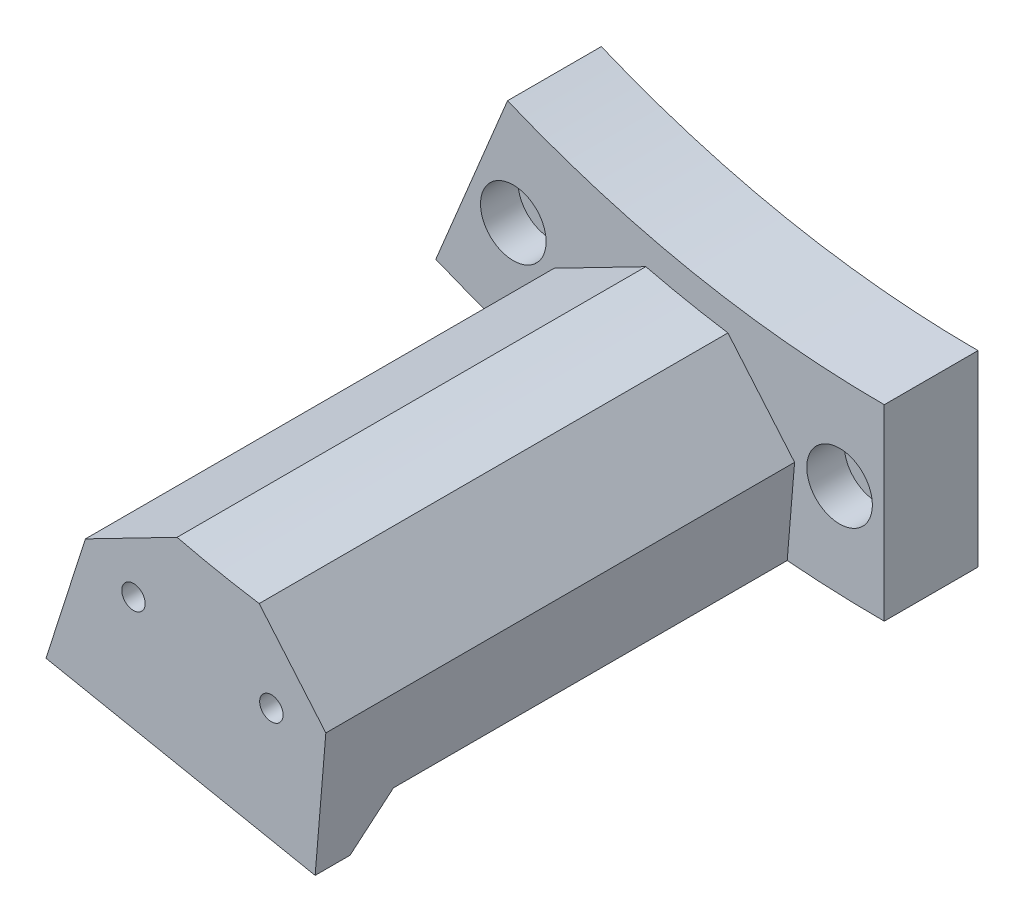
ISO-10303-21;
HEADER;
FILE_DESCRIPTION(('STEP AP214'),'2;1');
FILE_NAME('part.step','',(''),(''),'','','');
FILE_SCHEMA(('AUTOMOTIVE_DESIGN { 1 0 10303 214 1 1 1 1 }'));
ENDSEC;
DATA;
#1=APPLICATION_CONTEXT('core data for automotive mechanical design processes');
#2=APPLICATION_PROTOCOL_DEFINITION('international standard','automotive_design',2000,#1);
#3=PRODUCT_CONTEXT('',#1,'mechanical');
#4=PRODUCT('Part','Part','',(#3));
#5=PRODUCT_RELATED_PRODUCT_CATEGORY('part','',(#4));
#6=PRODUCT_DEFINITION_FORMATION('','',#4);
#7=PRODUCT_DEFINITION_CONTEXT('part definition',#1,'design');
#8=PRODUCT_DEFINITION('design','',#6,#7);
#9=PRODUCT_DEFINITION_SHAPE('','',#8);
#10=(LENGTH_UNIT() NAMED_UNIT(*) SI_UNIT(.MILLI.,.METRE.));
#11=(NAMED_UNIT(*) PLANE_ANGLE_UNIT() SI_UNIT($,.RADIAN.));
#12=(NAMED_UNIT(*) SI_UNIT($,.STERADIAN.) SOLID_ANGLE_UNIT());
#13=UNCERTAINTY_MEASURE_WITH_UNIT(LENGTH_MEASURE(1.E-05),#10,'distance_accuracy_value','');
#14=(GEOMETRIC_REPRESENTATION_CONTEXT(3) GLOBAL_UNCERTAINTY_ASSIGNED_CONTEXT((#13)) GLOBAL_UNIT_ASSIGNED_CONTEXT((#10,
#11,#12)) REPRESENTATION_CONTEXT('',''));
#15=CARTESIAN_POINT('',(0.,0.,0.));
#16=DIRECTION('',(0.,0.,1.));
#17=DIRECTION('',(1.,0.,0.));
#18=AXIS2_PLACEMENT_3D('',#15,#16,#17);
#19=CARTESIAN_POINT('',(-39.5679831879644,-107.978584480613,-0.000999999999999265));
#20=DIRECTION('',(0.,0.,1.));
#21=DIRECTION('',(1.,0.,0.));
#22=AXIS2_PLACEMENT_3D('',#19,#20,#21);
#23=CYLINDRICAL_SURFACE('',#22,1.75);
#24=CARTESIAN_POINT('',(-39.5679831879644,-107.978584480613,0.));
#25=DIRECTION('',(0.,0.,-1.));
#26=DIRECTION('',(-1.,0.,0.));
#27=AXIS2_PLACEMENT_3D('',#24,#25,#26);
#28=CIRCLE('',#27,1.75);
#29=CARTESIAN_POINT('',(-41.3179831879644,-107.978584480613,0.));
#30=VERTEX_POINT('',#29);
#31=EDGE_CURVE('E290',#30,#30,#28,.F.);
#32=ORIENTED_EDGE('',*,*,#31,.F.);
#33=EDGE_LOOP('',(#32));
#34=FACE_BOUND('',#33,.T.);
#35=CARTESIAN_POINT('',(-39.5679831879644,-107.978584480613,6.));
#36=DIRECTION('',(0.,0.,1.));
#37=DIRECTION('',(1.,0.,0.));
#38=AXIS2_PLACEMENT_3D('',#35,#36,#37);
#39=CIRCLE('',#38,1.75);
#40=CARTESIAN_POINT('',(-37.8179831879644,-107.978584480613,6.));
#41=VERTEX_POINT('',#40);
#42=EDGE_CURVE('E292',#41,#41,#39,.F.);
#43=ORIENTED_EDGE('',*,*,#42,.F.);
#44=EDGE_LOOP('',(#43));
#45=FACE_BOUND('',#44,.T.);
#46=ADVANCED_FACE('F39',(#34,#45),#23,.F.);
#47=CARTESIAN_POINT('',(-4.76556552085401,-114.901215769314,-0.000999999999999265));
#48=DIRECTION('',(0.,0.,1.));
#49=DIRECTION('',(1.,0.,0.));
#50=AXIS2_PLACEMENT_3D('',#47,#48,#49);
#51=CYLINDRICAL_SURFACE('',#50,1.75000000000001);
#52=CARTESIAN_POINT('',(-4.76556552085401,-114.901215769314,0.));
#53=DIRECTION('',(0.,0.,-1.));
#54=DIRECTION('',(-1.,0.,0.));
#55=AXIS2_PLACEMENT_3D('',#52,#53,#54);
#56=CIRCLE('',#55,1.75000000000001);
#57=CARTESIAN_POINT('',(-6.51556552085402,-114.901215769314,0.));
#58=VERTEX_POINT('',#57);
#59=EDGE_CURVE('E287',#58,#58,#56,.F.);
#60=ORIENTED_EDGE('',*,*,#59,.F.);
#61=EDGE_LOOP('',(#60));
#62=FACE_BOUND('',#61,.T.);
#63=CARTESIAN_POINT('',(-4.76556552085401,-114.901215769314,6.));
#64=DIRECTION('',(0.,0.,1.));
#65=DIRECTION('',(1.,0.,0.));
#66=AXIS2_PLACEMENT_3D('',#63,#64,#65);
#67=CIRCLE('',#66,1.75000000000001);
#68=CARTESIAN_POINT('',(-3.01556552085401,-114.901215769314,6.));
#69=VERTEX_POINT('',#68);
#70=EDGE_CURVE('E276',#69,#69,#67,.F.);
#71=ORIENTED_EDGE('',*,*,#70,.F.);
#72=EDGE_LOOP('',(#71));
#73=FACE_BOUND('',#72,.T.);
#74=ADVANCED_FACE('F242',(#62,#73),#51,.F.);
#75=CARTESIAN_POINT('',(0.,0.,10.));
#76=DIRECTION('',(0.,0.,-1.));
#77=DIRECTION('',(-1.,0.,0.));
#78=AXIS2_PLACEMENT_3D('',#75,#76,#77);
#79=PLANE('',#78);
#80=CARTESIAN_POINT('',(-39.5679831879644,-107.978584480613,10.));
#81=DIRECTION('',(0.,0.,1.));
#82=DIRECTION('',(1.,0.,0.));
#83=AXIS2_PLACEMENT_3D('',#80,#81,#82);
#84=CIRCLE('',#83,3.5);
#85=CARTESIAN_POINT('',(-36.0679831879644,-107.978584480613,10.));
#86=VERTEX_POINT('',#85);
#87=EDGE_CURVE('E277',#86,#86,#84,.T.);
#88=ORIENTED_EDGE('',*,*,#87,.F.);
#89=EDGE_LOOP('',(#88));
#90=FACE_BOUND('',#89,.T.);
#91=CARTESIAN_POINT('',(-4.76556552085401,-114.901215769314,10.));
#92=DIRECTION('',(0.,0.,1.));
#93=DIRECTION('',(1.,0.,0.));
#94=AXIS2_PLACEMENT_3D('',#91,#92,#93);
#95=CIRCLE('',#94,3.5);
#96=CARTESIAN_POINT('',(-1.26556552085401,-114.901215769314,10.));
#97=VERTEX_POINT('',#96);
#98=EDGE_CURVE('E283',#97,#97,#95,.T.);
#99=ORIENTED_EDGE('',*,*,#98,.F.);
#100=EDGE_LOOP('',(#99));
#101=FACE_BOUND('',#100,.T.);
#102=DIRECTION('',(-0.304864299028011,-0.952395799643278,0.));
#103=VECTOR('',#102,1.);
#104=CARTESIAN_POINT('',(-32.9253442950252,-102.858746361474,10.));
#105=LINE('',#104,#103);
#106=CARTESIAN_POINT('',(-35.2118265377353,-110.001714858799,10.));
#107=VERTEX_POINT('',#106);
#108=CARTESIAN_POINT('',(-38.1080373785014,-119.04947495541,10.));
#109=VERTEX_POINT('',#108);
#110=EDGE_CURVE('E160',#107,#109,#105,.T.);
#111=ORIENTED_EDGE('',*,*,#110,.F.);
#112=DIRECTION('',(-0.889017141485737,-0.457873915116956,0.));
#113=VECTOR('',#112,1.);
#114=CARTESIAN_POINT('',(37.3949441605316,-72.6067706982671,10.));
#115=LINE('',#114,#113);
#116=CARTESIAN_POINT('',(-25.4295453835583,-104.963508999964,10.));
#117=VERTEX_POINT('',#116);
#118=EDGE_CURVE('E11',#107,#117,#115,.F.);
#119=ORIENTED_EDGE('',*,*,#118,.T.);
#120=CARTESIAN_POINT('',(0.,0.,10.));
#121=DIRECTION('',(0.,0.,-1.));
#122=DIRECTION('',(-1.,0.,0.));
#123=AXIS2_PLACEMENT_3D('',#120,#121,#122);
#124=CIRCLE('',#123,108.);
#125=CARTESIAN_POINT('',(-16.6739593962537,-106.705103336495,10.));
#126=VERTEX_POINT('',#125);
#127=EDGE_CURVE('E157',#126,#117,#124,.T.);
#128=ORIENTED_EDGE('',*,*,#127,.F.);
#129=DIRECTION('',(-0.646123979642962,0.76323246978253,0.));
#130=VECTOR('',#129,1.);
#131=CARTESIAN_POINT('',(-62.3338317530755,-52.7694837854156,10.));
#132=LINE('',#131,#130);
#133=CARTESIAN_POINT('',(-9.56434796765956,-115.103315538491,10.));
#134=VERTEX_POINT('',#133);
#135=EDGE_CURVE('E48',#126,#134,#132,.F.);
#136=ORIENTED_EDGE('',*,*,#135,.T.);
#137=DIRECTION('',(0.0828082075122041,0.996565502497762,0.));
#138=VECTOR('',#137,1.);
#139=CARTESIAN_POINT('',(-8.94328641131803,-107.629074269758,10.));
#140=LINE('',#139,#138);
#141=CARTESIAN_POINT('',(-10.3510259390255,-124.57068781222,10.));
#142=VERTEX_POINT('',#141);
#143=EDGE_CURVE('E144',#142,#134,#140,.T.);
#144=ORIENTED_EDGE('',*,*,#143,.F.);
#145=CARTESIAN_POINT('',(0.,0.,10.));
#146=DIRECTION('',(0.,0.,1.));
#147=DIRECTION('',(-1.,0.,0.));
#148=AXIS2_PLACEMENT_3D('',#145,#146,#147);
#149=CIRCLE('',#148,125.);
#150=CARTESIAN_POINT('',(0.,-125.,10.));
#151=VERTEX_POINT('',#150);
#152=EDGE_CURVE('E172',#142,#151,#149,.T.);
#153=ORIENTED_EDGE('',*,*,#152,.T.);
#154=DIRECTION('',(0.,1.,0.));
#155=VECTOR('',#154,1.);
#156=CARTESIAN_POINT('',(0.,-105.,10.));
#157=LINE('',#156,#155);
#158=CARTESIAN_POINT('',(0.,-105.,10.));
#159=VERTEX_POINT('',#158);
#160=EDGE_CURVE('E171',#151,#159,#157,.T.);
#161=ORIENTED_EDGE('',*,*,#160,.T.);
#162=CARTESIAN_POINT('',(0.,0.,10.));
#163=DIRECTION('',(0.,0.,-1.));
#164=DIRECTION('',(-1.,0.,0.));
#165=AXIS2_PLACEMENT_3D('',#162,#163,#164);
#166=CIRCLE('',#165,105.);
#167=CARTESIAN_POINT('',(-40.1817603983344,-97.0073509136851,10.));
#168=VERTEX_POINT('',#167);
#169=EDGE_CURVE('E174',#159,#168,#166,.T.);
#170=ORIENTED_EDGE('',*,*,#169,.T.);
#171=DIRECTION('',(-0.38268343236509,-0.923879532511286,0.));
#172=VECTOR('',#171,1.);
#173=CARTESIAN_POINT('',(-40.1817603983345,-97.0073509136851,10.));
#174=LINE('',#173,#172);
#175=CARTESIAN_POINT('',(-47.8354290456363,-115.484941563911,10.));
#176=VERTEX_POINT('',#175);
#177=EDGE_CURVE('E176',#168,#176,#174,.T.);
#178=ORIENTED_EDGE('',*,*,#177,.T.);
#179=EDGE_CURVE('E168',#176,#109,#149,.T.);
#180=ORIENTED_EDGE('',*,*,#179,.T.);
#181=EDGE_LOOP('',(#111,#119,#128,#136,#144,#153,#161,#170,#178,#180));
#182=FACE_BOUND('',#181,.T.);
#183=ADVANCED_FACE('F248',(#90,#101,#182),#79,.F.);
#184=CARTESIAN_POINT('',(0.,0.,10.));
#185=DIRECTION('',(0.,0.,-1.));
#186=DIRECTION('',(-1.,0.,0.));
#187=AXIS2_PLACEMENT_3D('',#184,#185,#186);
#188=CYLINDRICAL_SURFACE('',#187,125.);
#189=DIRECTION('',(0.,0.,-1.));
#190=VECTOR('',#189,1.);
#191=CARTESIAN_POINT('',(-10.3510259390255,-124.57068781222,58.));
#192=LINE('',#191,#190);
#193=CARTESIAN_POINT('',(-10.3510259390255,-124.57068781222,52.));
#194=VERTEX_POINT('',#193);
#195=EDGE_CURVE('E165',#194,#142,#192,.T.);
#196=ORIENTED_EDGE('',*,*,#195,.F.);
#197=CARTESIAN_POINT('',(0.,0.,52.));
#198=DIRECTION('',(0.,0.,1.));
#199=DIRECTION('',(1.,0.,0.));
#200=AXIS2_PLACEMENT_3D('',#197,#198,#199);
#201=CIRCLE('',#200,125.);
#202=CARTESIAN_POINT('',(-38.1080373785014,-119.04947495541,52.));
#203=VERTEX_POINT('',#202);
#204=EDGE_CURVE('E198',#194,#203,#201,.F.);
#205=ORIENTED_EDGE('',*,*,#204,.T.);
#206=DIRECTION('',(0.,0.,-1.));
#207=VECTOR('',#206,1.);
#208=CARTESIAN_POINT('',(-38.1080373785014,-119.04947495541,58.));
#209=LINE('',#208,#207);
#210=EDGE_CURVE('E162',#203,#109,#209,.T.);
#211=ORIENTED_EDGE('',*,*,#210,.T.);
#212=ORIENTED_EDGE('',*,*,#179,.F.);
#213=DIRECTION('',(0.,0.,-1.));
#214=VECTOR('',#213,1.);
#215=CARTESIAN_POINT('',(-47.8354290456363,-115.484941563911,10.));
#216=LINE('',#215,#214);
#217=CARTESIAN_POINT('',(-47.8354290456363,-115.484941563911,0.));
#218=VERTEX_POINT('',#217);
#219=EDGE_CURVE('E178',#176,#218,#216,.T.);
#220=ORIENTED_EDGE('',*,*,#219,.T.);
#221=CARTESIAN_POINT('',(0.,0.,0.));
#222=DIRECTION('',(0.,0.,1.));
#223=DIRECTION('',(-1.,0.,0.));
#224=AXIS2_PLACEMENT_3D('',#221,#222,#223);
#225=CIRCLE('',#224,125.);
#226=CARTESIAN_POINT('',(0.,-125.,0.));
#227=VERTEX_POINT('',#226);
#228=EDGE_CURVE('E167',#218,#227,#225,.T.);
#229=ORIENTED_EDGE('',*,*,#228,.T.);
#230=DIRECTION('',(0.,0.,-1.));
#231=VECTOR('',#230,1.);
#232=CARTESIAN_POINT('',(0.,-125.,10.));
#233=LINE('',#232,#231);
#234=EDGE_CURVE('E195',#151,#227,#233,.T.);
#235=ORIENTED_EDGE('',*,*,#234,.F.);
#236=ORIENTED_EDGE('',*,*,#152,.F.);
#237=EDGE_LOOP('',(#196,#205,#211,#212,#220,#229,#235,#236));
#238=FACE_BOUND('',#237,.T.);
#239=ADVANCED_FACE('F224',(#238),#188,.T.);
#240=CARTESIAN_POINT('',(0.,-105.,10.));
#241=DIRECTION('',(-1.,0.,0.));
#242=DIRECTION('',(0.,-1.,0.));
#243=AXIS2_PLACEMENT_3D('',#240,#241,#242);
#244=PLANE('',#243);
#245=DIRECTION('',(0.,1.,0.));
#246=VECTOR('',#245,1.);
#247=CARTESIAN_POINT('',(0.,-105.,0.));
#248=LINE('',#247,#246);
#249=CARTESIAN_POINT('',(0.,-105.,0.));
#250=VERTEX_POINT('',#249);
#251=EDGE_CURVE('E181',#227,#250,#248,.T.);
#252=ORIENTED_EDGE('',*,*,#251,.T.);
#253=DIRECTION('',(0.,0.,-1.));
#254=VECTOR('',#253,1.);
#255=CARTESIAN_POINT('',(0.,-105.,10.));
#256=LINE('',#255,#254);
#257=EDGE_CURVE('E192',#159,#250,#256,.T.);
#258=ORIENTED_EDGE('',*,*,#257,.F.);
#259=ORIENTED_EDGE('',*,*,#160,.F.);
#260=ORIENTED_EDGE('',*,*,#234,.T.);
#261=EDGE_LOOP('',(#252,#258,#259,#260));
#262=FACE_BOUND('',#261,.T.);
#263=ADVANCED_FACE('F328',(#262),#244,.F.);
#264=CARTESIAN_POINT('',(0.,0.,10.));
#265=DIRECTION('',(0.,0.,-1.));
#266=DIRECTION('',(-1.,0.,0.));
#267=AXIS2_PLACEMENT_3D('',#264,#265,#266);
#268=CYLINDRICAL_SURFACE('',#267,105.);
#269=CARTESIAN_POINT('',(0.,0.,0.));
#270=DIRECTION('',(0.,0.,-1.));
#271=DIRECTION('',(-1.,0.,0.));
#272=AXIS2_PLACEMENT_3D('',#269,#270,#271);
#273=CIRCLE('',#272,105.);
#274=CARTESIAN_POINT('',(-40.1817603983344,-97.0073509136851,0.));
#275=VERTEX_POINT('',#274);
#276=EDGE_CURVE('E183',#250,#275,#273,.T.);
#277=ORIENTED_EDGE('',*,*,#276,.T.);
#278=DIRECTION('',(0.,0.,-1.));
#279=VECTOR('',#278,1.);
#280=CARTESIAN_POINT('',(-40.1817603983344,-97.0073509136851,10.));
#281=LINE('',#280,#279);
#282=EDGE_CURVE('E189',#168,#275,#281,.T.);
#283=ORIENTED_EDGE('',*,*,#282,.F.);
#284=ORIENTED_EDGE('',*,*,#169,.F.);
#285=ORIENTED_EDGE('',*,*,#257,.T.);
#286=EDGE_LOOP('',(#277,#283,#284,#285));
#287=FACE_BOUND('',#286,.T.);
#288=ADVANCED_FACE('F333',(#287),#268,.F.);
#289=CARTESIAN_POINT('',(-40.1817603983345,-97.0073509136851,10.));
#290=DIRECTION('',(0.923879532511287,-0.38268343236509,0.));
#291=DIRECTION('',(0.38268343236509,0.923879532511287,0.));
#292=AXIS2_PLACEMENT_3D('',#289,#290,#291);
#293=PLANE('',#292);
#294=DIRECTION('',(-0.38268343236509,-0.923879532511286,0.));
#295=VECTOR('',#294,1.);
#296=CARTESIAN_POINT('',(-40.1817603983345,-97.0073509136851,0.));
#297=LINE('',#296,#295);
#298=EDGE_CURVE('E185',#275,#218,#297,.T.);
#299=ORIENTED_EDGE('',*,*,#298,.T.);
#300=ORIENTED_EDGE('',*,*,#219,.F.);
#301=ORIENTED_EDGE('',*,*,#177,.F.);
#302=ORIENTED_EDGE('',*,*,#282,.T.);
#303=EDGE_LOOP('',(#299,#300,#301,#302));
#304=FACE_BOUND('',#303,.T.);
#305=ADVANCED_FACE('F338',(#304),#293,.F.);
#306=CARTESIAN_POINT('',(0.,0.,0.));
#307=DIRECTION('',(0.,0.,-1.));
#308=DIRECTION('',(-1.,0.,0.));
#309=AXIS2_PLACEMENT_3D('',#306,#307,#308);
#310=PLANE('',#309);
#311=ORIENTED_EDGE('',*,*,#59,.T.);
#312=EDGE_LOOP('',(#311));
#313=FACE_BOUND('',#312,.T.);
#314=ORIENTED_EDGE('',*,*,#31,.T.);
#315=EDGE_LOOP('',(#314));
#316=FACE_BOUND('',#315,.T.);
#317=ORIENTED_EDGE('',*,*,#228,.F.);
#318=ORIENTED_EDGE('',*,*,#298,.F.);
#319=ORIENTED_EDGE('',*,*,#276,.F.);
#320=ORIENTED_EDGE('',*,*,#251,.F.);
#321=EDGE_LOOP('',(#317,#318,#319,#320));
#322=FACE_BOUND('',#321,.T.);
#323=ADVANCED_FACE('F348',(#313,#316,#322),#310,.T.);
#324=CARTESIAN_POINT('',(-8.94328641131803,-107.629074269758,58.));
#325=DIRECTION('',(-0.996565502497761,0.0828082075122041,0.));
#326=DIRECTION('',(-0.0828082075122041,-0.996565502497761,0.));
#327=AXIS2_PLACEMENT_3D('',#324,#325,#326);
#328=PLANE('',#327);
#329=ORIENTED_EDGE('',*,*,#143,.T.);
#330=DIRECTION('',(0.,0.,1.));
#331=VECTOR('',#330,1.);
#332=CARTESIAN_POINT('',(-9.56434796765956,-115.103315538491,58.));
#333=LINE('',#332,#331);
#334=CARTESIAN_POINT('',(-9.56434796765954,-115.103315538491,60.));
#335=VERTEX_POINT('',#334);
#336=EDGE_CURVE('E300',#134,#335,#333,.T.);
#337=ORIENTED_EDGE('',*,*,#336,.T.);
#338=DIRECTION('',(0.0828082075122008,0.996565502497762,0.));
#339=VECTOR('',#338,1.);
#340=CARTESIAN_POINT('',(-10.705530952967,-128.837021765948,60.));
#341=LINE('',#340,#339);
#342=CARTESIAN_POINT('',(-10.705530952967,-128.837021765948,60.));
#343=VERTEX_POINT('',#342);
#344=EDGE_CURVE('E149',#343,#335,#341,.T.);
#345=ORIENTED_EDGE('',*,*,#344,.F.);
#346=DIRECTION('',(0.,0.,-1.));
#347=VECTOR('',#346,1.);
#348=CARTESIAN_POINT('',(-10.705530952967,-128.837021765948,60.));
#349=LINE('',#348,#347);
#350=CARTESIAN_POINT('',(-10.705530952967,-128.837021765948,56.2810371651781));
#351=VERTEX_POINT('',#350);
#352=EDGE_CURVE('E145',#343,#351,#349,.T.);
#353=ORIENTED_EDGE('',*,*,#352,.T.);
#354=DIRECTION('',(-0.0585542450697827,-0.704678224712751,0.707106781186543));
#355=VECTOR('',#354,1.);
#356=CARTESIAN_POINT('',(0.,0.,-72.9999999999985));
#357=LINE('',#356,#355);
#358=EDGE_CURVE('E209',#351,#194,#357,.F.);
#359=ORIENTED_EDGE('',*,*,#358,.T.);
#360=ORIENTED_EDGE('',*,*,#195,.T.);
#361=EDGE_LOOP('',(#329,#337,#345,#353,#359,#360));
#362=FACE_BOUND('',#361,.T.);
#363=ADVANCED_FACE('F314',(#362),#328,.F.);
#364=CARTESIAN_POINT('',(0.,0.,58.));
#365=DIRECTION('',(0.,0.,-1.));
#366=DIRECTION('',(-1.,0.,0.));
#367=AXIS2_PLACEMENT_3D('',#364,#365,#366);
#368=CYLINDRICAL_SURFACE('',#367,108.);
#369=CARTESIAN_POINT('',(0.,0.,60.));
#370=DIRECTION('',(0.,0.,-1.));
#371=DIRECTION('',(1.,0.,0.));
#372=AXIS2_PLACEMENT_3D('',#369,#370,#371);
#373=CIRCLE('',#372,108.);
#374=CARTESIAN_POINT('',(-16.6739593962537,-106.705103336495,60.));
#375=VERTEX_POINT('',#374);
#376=CARTESIAN_POINT('',(-25.4295453835583,-104.963508999964,60.));
#377=VERTEX_POINT('',#376);
#378=EDGE_CURVE('E134',#375,#377,#373,.T.);
#379=ORIENTED_EDGE('',*,*,#378,.F.);
#380=DIRECTION('',(0.,0.,-1.));
#381=VECTOR('',#380,1.);
#382=CARTESIAN_POINT('',(-16.6739593962537,-106.705103336495,58.));
#383=LINE('',#382,#381);
#384=EDGE_CURVE('E303',#375,#126,#383,.T.);
#385=ORIENTED_EDGE('',*,*,#384,.T.);
#386=ORIENTED_EDGE('',*,*,#127,.T.);
#387=DIRECTION('',(0.,0.,-1.));
#388=VECTOR('',#387,1.);
#389=CARTESIAN_POINT('',(-25.4295453835583,-104.963508999964,58.));
#390=LINE('',#389,#388);
#391=EDGE_CURVE('E298',#117,#377,#390,.F.);
#392=ORIENTED_EDGE('',*,*,#391,.T.);
#393=EDGE_LOOP('',(#379,#385,#386,#392));
#394=FACE_BOUND('',#393,.T.);
#395=ADVANCED_FACE('F341',(#394),#368,.F.);
#396=CARTESIAN_POINT('',(-32.9253442950252,-102.858746361474,58.));
#397=DIRECTION('',(0.952395799643278,-0.304864299028011,0.));
#398=DIRECTION('',(0.304864299028011,0.952395799643278,0.));
#399=AXIS2_PLACEMENT_3D('',#396,#397,#398);
#400=PLANE('',#399);
#401=DIRECTION('',(-0.304864299028014,-0.952395799643277,0.));
#402=VECTOR('',#401,1.);
#403=CARTESIAN_POINT('',(-32.9253442950252,-102.858746361474,60.));
#404=LINE('',#403,#402);
#405=CARTESIAN_POINT('',(-35.2118265377353,-110.001714858799,60.));
#406=VERTEX_POINT('',#405);
#407=CARTESIAN_POINT('',(-39.4131727729763,-123.126716769642,60.));
#408=VERTEX_POINT('',#407);
#409=EDGE_CURVE('E126',#406,#408,#404,.T.);
#410=ORIENTED_EDGE('',*,*,#409,.F.);
#411=DIRECTION('',(0.,0.,-1.));
#412=VECTOR('',#411,1.);
#413=CARTESIAN_POINT('',(-35.2118265377353,-110.001714858799,58.));
#414=LINE('',#413,#412);
#415=EDGE_CURVE('E299',#406,#107,#414,.T.);
#416=ORIENTED_EDGE('',*,*,#415,.T.);
#417=ORIENTED_EDGE('',*,*,#110,.T.);
#418=ORIENTED_EDGE('',*,*,#210,.F.);
#419=DIRECTION('',(0.215571613184391,0.673445528301351,-0.707106781186543));
#420=VECTOR('',#419,1.);
#421=CARTESIAN_POINT('',(0.,0.,-72.9999999999985));
#422=LINE('',#421,#420);
#423=CARTESIAN_POINT('',(-39.4131727729763,-123.126716769642,56.2810371651781));
#424=VERTEX_POINT('',#423);
#425=EDGE_CURVE('E140',#203,#424,#422,.F.);
#426=ORIENTED_EDGE('',*,*,#425,.T.);
#427=DIRECTION('',(0.,0.,-1.));
#428=VECTOR('',#427,1.);
#429=CARTESIAN_POINT('',(-39.4131727729763,-123.126716769642,60.));
#430=LINE('',#429,#428);
#431=EDGE_CURVE('E137',#408,#424,#430,.T.);
#432=ORIENTED_EDGE('',*,*,#431,.F.);
#433=EDGE_LOOP('',(#410,#416,#417,#418,#426,#432));
#434=FACE_BOUND('',#433,.T.);
#435=ADVANCED_FACE('F138',(#434),#400,.F.);
#436=CARTESIAN_POINT('',(-39.4131727729763,-123.126716769642,60.));
#437=DIRECTION('',(0.195090322016128,0.980785280403231,0.));
#438=DIRECTION('',(-0.980785280403231,0.195090322016128,0.));
#439=AXIS2_PLACEMENT_3D('',#436,#437,#438);
#440=PLANE('',#439);
#441=ORIENTED_EDGE('',*,*,#431,.T.);
#442=CARTESIAN_POINT('',(-39.4131727729763,-123.126716769642,56.2810371651781));
#443=CARTESIAN_POINT('',(-38.2201790916378,-123.364017967066,56.1433083503061));
#444=CARTESIAN_POINT('',(-37.025306607688,-123.601692881566,56.0223725359379));
#445=CARTESIAN_POINT('',(-34.6326903117571,-124.07761385322,55.8146060129514));
#446=CARTESIAN_POINT('',(-33.4349464418977,-124.315859921889,55.7277759977163));
#447=CARTESIAN_POINT('',(-31.0413679692097,-124.7919722824,55.5889688400575));
#448=CARTESIAN_POINT('',(-29.8455395690514,-125.029837340455,55.5368807754856));
#449=CARTESIAN_POINT('',(-27.4529247269721,-125.505758022921,55.4673965328125));
#450=CARTESIAN_POINT('',(-26.2561382949719,-125.743813645358,55.4499999999999));
#451=CARTESIAN_POINT('',(-23.8625654309714,-126.219924890232,55.4499999999999));
#452=CARTESIAN_POINT('',(-22.6657789989712,-126.457980512669,55.4673965328125));
#453=CARTESIAN_POINT('',(-20.2731641568919,-126.933901195135,55.5368807754856));
#454=CARTESIAN_POINT('',(-19.0773357567337,-127.17176625319,55.5889688400575));
#455=CARTESIAN_POINT('',(-16.6837572840457,-127.647878613701,55.7277759977163));
#456=CARTESIAN_POINT('',(-15.4860134141863,-127.88612468237,55.8146060129515));
#457=CARTESIAN_POINT('',(-13.0933971182553,-128.362045654024,56.0223725359379));
#458=CARTESIAN_POINT('',(-11.8985246343055,-128.599720568524,56.1433083503061));
#459=CARTESIAN_POINT('',(-10.705530952967,-128.837021765948,56.2810371651781));
#460=B_SPLINE_CURVE_WITH_KNOTS('',3,(#442,#443,#444,#445,#446,#447,#448,#449,#450,#451,#452,
#453,#454,#455,#456,#457,#458,#459),.UNSPECIFIED.,.F.,.F.,(4,2,2,2,2,2,2,2,4),(0.,
3.67231993327199,7.3447145222481,11.0053272424226,14.6659025336614,18.3264778249003,
21.9870905450748,25.6594851340509,29.3318050673228),.UNSPECIFIED.);
#461=EDGE_CURVE('E201',#424,#351,#460,.T.);
#462=ORIENTED_EDGE('',*,*,#461,.T.);
#463=ORIENTED_EDGE('',*,*,#352,.F.);
#464=DIRECTION('',(0.98078528040323,-0.195090322016128,0.));
#465=VECTOR('',#464,1.);
#466=CARTESIAN_POINT('',(-39.4131727729763,-123.126716769642,60.));
#467=LINE('',#466,#465);
#468=EDGE_CURVE('E131',#408,#343,#467,.T.);
#469=ORIENTED_EDGE('',*,*,#468,.F.);
#470=EDGE_LOOP('',(#441,#462,#463,#469));
#471=FACE_BOUND('',#470,.T.);
#472=ADVANCED_FACE('F147',(#471),#440,.F.);
#473=CARTESIAN_POINT('',(0.,0.,60.));
#474=DIRECTION('',(0.,0.,1.));
#475=DIRECTION('',(1.,0.,0.));
#476=AXIS2_PLACEMENT_3D('',#473,#474,#475);
#477=PLANE('',#476);
#478=CARTESIAN_POINT('',(-30.0839121179032,-112.798307751855,60.));
#479=DIRECTION('',(0.,0.,1.));
#480=DIRECTION('',(1.,0.,0.));
#481=AXIS2_PLACEMENT_3D('',#478,#479,#480);
#482=CIRCLE('',#481,1.25);
#483=CARTESIAN_POINT('',(-28.8339121179032,-112.798307751855,60.));
#484=VERTEX_POINT('',#483);
#485=EDGE_CURVE('E262',#484,#484,#482,.T.);
#486=ORIENTED_EDGE('',*,*,#485,.F.);
#487=EDGE_LOOP('',(#486));
#488=FACE_BOUND('',#487,.T.);
#489=CARTESIAN_POINT('',(-15.3721329118547,-115.724662582097,60.));
#490=DIRECTION('',(0.,0.,1.));
#491=DIRECTION('',(1.,0.,0.));
#492=AXIS2_PLACEMENT_3D('',#489,#490,#491);
#493=CIRCLE('',#492,1.25);
#494=CARTESIAN_POINT('',(-14.1221329118547,-115.724662582097,60.));
#495=VERTEX_POINT('',#494);
#496=EDGE_CURVE('E265',#495,#495,#493,.T.);
#497=ORIENTED_EDGE('',*,*,#496,.F.);
#498=EDGE_LOOP('',(#497));
#499=FACE_BOUND('',#498,.T.);
#500=ORIENTED_EDGE('',*,*,#344,.T.);
#501=DIRECTION('',(0.646123979642962,-0.76323246978253,0.));
#502=VECTOR('',#501,1.);
#503=CARTESIAN_POINT('',(-62.3338317530755,-52.7694837854156,60.));
#504=LINE('',#503,#502);
#505=EDGE_CURVE('E294',#335,#375,#504,.F.);
#506=ORIENTED_EDGE('',*,*,#505,.T.);
#507=ORIENTED_EDGE('',*,*,#378,.T.);
#508=DIRECTION('',(0.889017141485737,0.457873915116956,0.));
#509=VECTOR('',#508,1.);
#510=CARTESIAN_POINT('',(37.3949441605316,-72.6067706982671,60.));
#511=LINE('',#510,#509);
#512=EDGE_CURVE('E61',#377,#406,#511,.F.);
#513=ORIENTED_EDGE('',*,*,#512,.T.);
#514=ORIENTED_EDGE('',*,*,#409,.T.);
#515=ORIENTED_EDGE('',*,*,#468,.T.);
#516=EDGE_LOOP('',(#500,#506,#507,#513,#514,#515));
#517=FACE_BOUND('',#516,.T.);
#518=ADVANCED_FACE('F129',(#488,#499,#517),#477,.T.);
#519=CARTESIAN_POINT('',(0.,0.,58.));
#520=DIRECTION('',(0.,0.,1.));
#521=DIRECTION('',(1.,0.,0.));
#522=AXIS2_PLACEMENT_3D('',#519,#520,#521);
#523=CONICAL_SURFACE('',#522,131.,0.785398163397455);
#524=ORIENTED_EDGE('',*,*,#425,.F.);
#525=ORIENTED_EDGE('',*,*,#204,.F.);
#526=ORIENTED_EDGE('',*,*,#358,.F.);
#527=ORIENTED_EDGE('',*,*,#461,.F.);
#528=EDGE_LOOP('',(#524,#525,#526,#527));
#529=FACE_BOUND('',#528,.T.);
#530=ADVANCED_FACE('F215',(#529),#523,.T.);
#531=CARTESIAN_POINT('',(-4.76556552085401,-114.901215769314,6.));
#532=DIRECTION('',(0.,0.,1.));
#533=DIRECTION('',(1.,0.,0.));
#534=AXIS2_PLACEMENT_3D('',#531,#532,#533);
#535=PLANE('',#534);
#536=CARTESIAN_POINT('',(-4.76556552085401,-114.901215769314,6.));
#537=DIRECTION('',(0.,0.,1.));
#538=DIRECTION('',(1.,0.,0.));
#539=AXIS2_PLACEMENT_3D('',#536,#537,#538);
#540=CIRCLE('',#539,3.5);
#541=CARTESIAN_POINT('',(-1.26556552085401,-114.901215769314,6.));
#542=VERTEX_POINT('',#541);
#543=EDGE_CURVE('E280',#542,#542,#540,.T.);
#544=ORIENTED_EDGE('',*,*,#543,.T.);
#545=EDGE_LOOP('',(#544));
#546=FACE_BOUND('',#545,.T.);
#547=ORIENTED_EDGE('',*,*,#70,.T.);
#548=EDGE_LOOP('',(#547));
#549=FACE_BOUND('',#548,.T.);
#550=ADVANCED_FACE('F222',(#546,#549),#535,.T.);
#551=CARTESIAN_POINT('',(-4.76556552085401,-114.901215769314,6.));
#552=DIRECTION('',(0.,0.,1.));
#553=DIRECTION('',(1.,0.,0.));
#554=AXIS2_PLACEMENT_3D('',#551,#552,#553);
#555=CYLINDRICAL_SURFACE('',#554,3.5);
#556=ORIENTED_EDGE('',*,*,#543,.F.);
#557=EDGE_LOOP('',(#556));
#558=FACE_BOUND('',#557,.T.);
#559=ORIENTED_EDGE('',*,*,#98,.T.);
#560=EDGE_LOOP('',(#559));
#561=FACE_BOUND('',#560,.T.);
#562=ADVANCED_FACE('F391',(#558,#561),#555,.F.);
#563=CARTESIAN_POINT('',(-39.5679831879644,-107.978584480613,6.));
#564=DIRECTION('',(0.,0.,1.));
#565=DIRECTION('',(1.,0.,0.));
#566=AXIS2_PLACEMENT_3D('',#563,#564,#565);
#567=PLANE('',#566);
#568=CARTESIAN_POINT('',(-39.5679831879644,-107.978584480613,6.));
#569=DIRECTION('',(0.,0.,1.));
#570=DIRECTION('',(1.,0.,0.));
#571=AXIS2_PLACEMENT_3D('',#568,#569,#570);
#572=CIRCLE('',#571,3.5);
#573=CARTESIAN_POINT('',(-36.0679831879644,-107.978584480613,6.));
#574=VERTEX_POINT('',#573);
#575=EDGE_CURVE('E273',#574,#574,#572,.T.);
#576=ORIENTED_EDGE('',*,*,#575,.T.);
#577=EDGE_LOOP('',(#576));
#578=FACE_BOUND('',#577,.T.);
#579=ORIENTED_EDGE('',*,*,#42,.T.);
#580=EDGE_LOOP('',(#579));
#581=FACE_BOUND('',#580,.T.);
#582=ADVANCED_FACE('F237',(#578,#581),#567,.T.);
#583=CARTESIAN_POINT('',(-39.5679831879644,-107.978584480613,6.));
#584=DIRECTION('',(0.,0.,1.));
#585=DIRECTION('',(1.,0.,0.));
#586=AXIS2_PLACEMENT_3D('',#583,#584,#585);
#587=CYLINDRICAL_SURFACE('',#586,3.5);
#588=ORIENTED_EDGE('',*,*,#575,.F.);
#589=EDGE_LOOP('',(#588));
#590=FACE_BOUND('',#589,.T.);
#591=ORIENTED_EDGE('',*,*,#87,.T.);
#592=EDGE_LOOP('',(#591));
#593=FACE_BOUND('',#592,.T.);
#594=ADVANCED_FACE('F230',(#590,#593),#587,.F.);
#595=CARTESIAN_POINT('',(-16.6739593962537,-106.705103336495,58.));
#596=DIRECTION('',(-0.76323246978253,-0.646123979642962,0.));
#597=DIRECTION('',(0.,0.,-1.));
#598=AXIS2_PLACEMENT_3D('',#595,#596,#597);
#599=PLANE('',#598);
#600=ORIENTED_EDGE('',*,*,#505,.F.);
#601=ORIENTED_EDGE('',*,*,#336,.F.);
#602=ORIENTED_EDGE('',*,*,#135,.F.);
#603=ORIENTED_EDGE('',*,*,#384,.F.);
#604=EDGE_LOOP('',(#600,#601,#602,#603));
#605=FACE_BOUND('',#604,.T.);
#606=ADVANCED_FACE('F226',(#605),#599,.F.);
#607=CARTESIAN_POINT('',(-35.2118265377353,-110.001714858799,58.));
#608=DIRECTION('',(0.457873915116956,-0.889017141485737,0.));
#609=DIRECTION('',(0.,0.,-1.));
#610=AXIS2_PLACEMENT_3D('',#607,#608,#609);
#611=PLANE('',#610);
#612=ORIENTED_EDGE('',*,*,#512,.F.);
#613=ORIENTED_EDGE('',*,*,#391,.F.);
#614=ORIENTED_EDGE('',*,*,#118,.F.);
#615=ORIENTED_EDGE('',*,*,#415,.F.);
#616=EDGE_LOOP('',(#612,#613,#614,#615));
#617=FACE_BOUND('',#616,.T.);
#618=ADVANCED_FACE('F42',(#617),#611,.F.);
#619=CARTESIAN_POINT('',(-15.3721329118547,-115.724662582097,50.));
#620=DIRECTION('',(0.,0.,1.));
#621=DIRECTION('',(1.,0.,0.));
#622=AXIS2_PLACEMENT_3D('',#619,#620,#621);
#623=CYLINDRICAL_SURFACE('',#622,1.25);
#624=CARTESIAN_POINT('',(-15.3721329118547,-115.724662582097,50.));
#625=DIRECTION('',(0.,0.,1.));
#626=DIRECTION('',(1.,0.,0.));
#627=AXIS2_PLACEMENT_3D('',#624,#625,#626);
#628=CIRCLE('',#627,1.25);
#629=CARTESIAN_POINT('',(-14.1221329118547,-115.724662582097,50.));
#630=VERTEX_POINT('',#629);
#631=EDGE_CURVE('E267',#630,#630,#628,.T.);
#632=ORIENTED_EDGE('',*,*,#631,.F.);
#633=EDGE_LOOP('',(#632));
#634=FACE_BOUND('',#633,.T.);
#635=ORIENTED_EDGE('',*,*,#496,.T.);
#636=EDGE_LOOP('',(#635));
#637=FACE_BOUND('',#636,.T.);
#638=ADVANCED_FACE('F236',(#634,#637),#623,.F.);
#639=CARTESIAN_POINT('',(-15.3721329118547,-115.724662582097,50.));
#640=DIRECTION('',(0.,0.,1.));
#641=DIRECTION('',(1.,0.,0.));
#642=AXIS2_PLACEMENT_3D('',#639,#640,#641);
#643=PLANE('',#642);
#644=ORIENTED_EDGE('',*,*,#631,.T.);
#645=EDGE_LOOP('',(#644));
#646=FACE_BOUND('',#645,.T.);
#647=ADVANCED_FACE('F434',(#646),#643,.T.);
#648=CARTESIAN_POINT('',(-30.0839121179032,-112.798307751855,50.));
#649=DIRECTION('',(0.,0.,1.));
#650=DIRECTION('',(1.,0.,0.));
#651=AXIS2_PLACEMENT_3D('',#648,#649,#650);
#652=CYLINDRICAL_SURFACE('',#651,1.25);
#653=CARTESIAN_POINT('',(-30.0839121179032,-112.798307751855,50.));
#654=DIRECTION('',(0.,0.,1.));
#655=DIRECTION('',(1.,0.,0.));
#656=AXIS2_PLACEMENT_3D('',#653,#654,#655);
#657=CIRCLE('',#656,1.25);
#658=CARTESIAN_POINT('',(-28.8339121179032,-112.798307751855,50.));
#659=VERTEX_POINT('',#658);
#660=EDGE_CURVE('E286',#659,#659,#657,.T.);
#661=ORIENTED_EDGE('',*,*,#660,.F.);
#662=EDGE_LOOP('',(#661));
#663=FACE_BOUND('',#662,.T.);
#664=ORIENTED_EDGE('',*,*,#485,.T.);
#665=EDGE_LOOP('',(#664));
#666=FACE_BOUND('',#665,.T.);
#667=ADVANCED_FACE('F443',(#663,#666),#652,.F.);
#668=CARTESIAN_POINT('',(-30.0839121179032,-112.798307751855,50.));
#669=DIRECTION('',(0.,0.,1.));
#670=DIRECTION('',(1.,0.,0.));
#671=AXIS2_PLACEMENT_3D('',#668,#669,#670);
#672=PLANE('',#671);
#673=ORIENTED_EDGE('',*,*,#660,.T.);
#674=EDGE_LOOP('',(#673));
#675=FACE_BOUND('',#674,.T.);
#676=ADVANCED_FACE('F452',(#675),#672,.T.);
#677=CLOSED_SHELL('',(#46,#74,#183,#239,#263,#288,#305,#323,#363,#395,#435,#472,#518,#530,#550,
#562,#582,#594,#606,#618,#638,#647,#667,#676));
#678=MANIFOLD_SOLID_BREP('B2',#677);
#679=ADVANCED_BREP_SHAPE_REPRESENTATION('',(#18,#678),#14);
#680=SHAPE_DEFINITION_REPRESENTATION(#9,#679);
ENDSEC;
END-ISO-10303-21;
